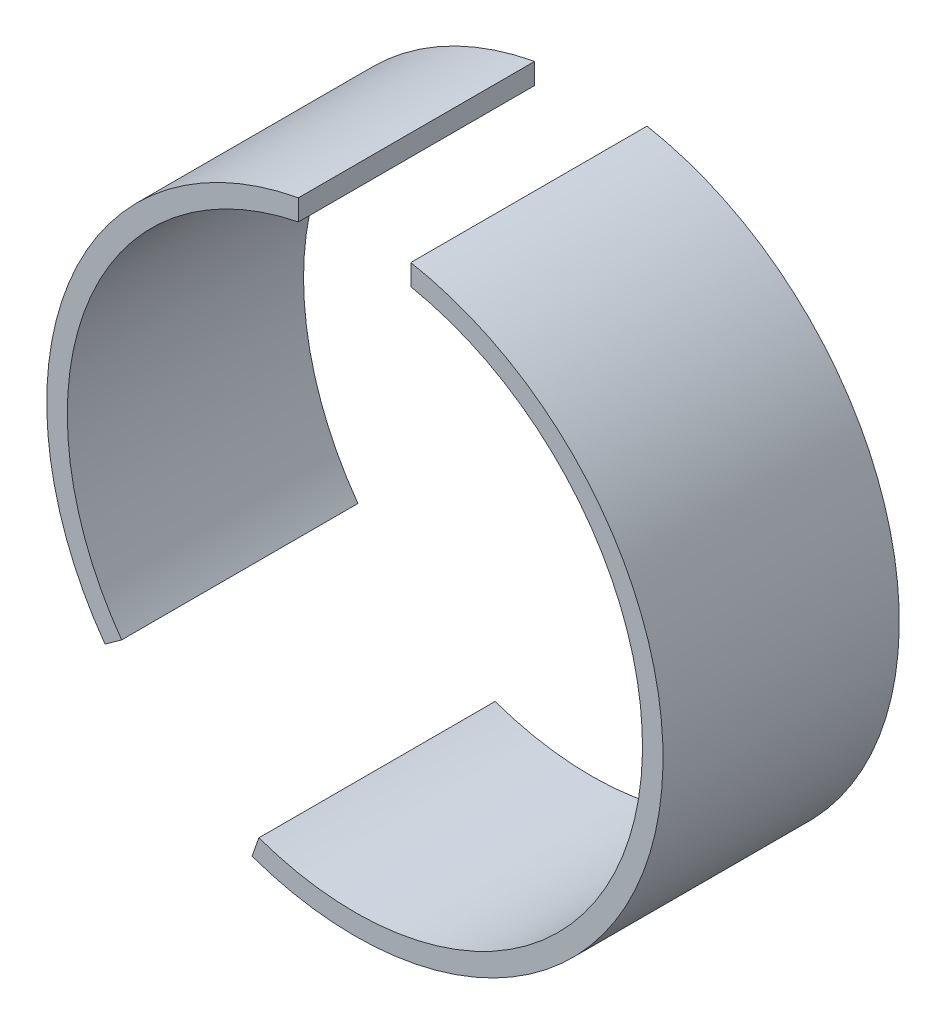
ISO-10303-21;
HEADER;
FILE_DESCRIPTION(('STEP AP214'),'2;1');
FILE_NAME('part.step','',(''),(''),'','','');
FILE_SCHEMA(('AUTOMOTIVE_DESIGN { 1 0 10303 214 1 1 1 1 }'));
ENDSEC;
DATA;
#1=APPLICATION_CONTEXT('core data for automotive mechanical design processes');
#2=APPLICATION_PROTOCOL_DEFINITION('international standard','automotive_design',2000,#1);
#3=PRODUCT_CONTEXT('',#1,'mechanical');
#4=PRODUCT('Part','Part','',(#3));
#5=PRODUCT_RELATED_PRODUCT_CATEGORY('part','',(#4));
#6=PRODUCT_DEFINITION_FORMATION('','',#4);
#7=PRODUCT_DEFINITION_CONTEXT('part definition',#1,'design');
#8=PRODUCT_DEFINITION('design','',#6,#7);
#9=PRODUCT_DEFINITION_SHAPE('','',#8);
#10=(LENGTH_UNIT() NAMED_UNIT(*) SI_UNIT(.MILLI.,.METRE.));
#11=(NAMED_UNIT(*) PLANE_ANGLE_UNIT() SI_UNIT($,.RADIAN.));
#12=(NAMED_UNIT(*) SI_UNIT($,.STERADIAN.) SOLID_ANGLE_UNIT());
#13=UNCERTAINTY_MEASURE_WITH_UNIT(LENGTH_MEASURE(1.E-05),#10,'distance_accuracy_value','');
#14=(GEOMETRIC_REPRESENTATION_CONTEXT(3) GLOBAL_UNCERTAINTY_ASSIGNED_CONTEXT((#13)) GLOBAL_UNIT_ASSIGNED_CONTEXT((#10,
#11,#12)) REPRESENTATION_CONTEXT('',''));
#15=CARTESIAN_POINT('',(0.,0.,0.));
#16=DIRECTION('',(0.,0.,1.));
#17=DIRECTION('',(1.,0.,0.));
#18=AXIS2_PLACEMENT_3D('',#15,#16,#17);
#19=CARTESIAN_POINT('',(0.,0.,23.));
#20=DIRECTION('',(0.,0.,-1.));
#21=DIRECTION('',(-1.,0.,0.));
#22=AXIS2_PLACEMENT_3D('',#19,#20,#21);
#23=CYLINDRICAL_SURFACE('',#22,28.);
#24=CARTESIAN_POINT('',(0.,0.,0.));
#25=DIRECTION('',(0.,0.,-1.));
#26=DIRECTION('',(1.,0.,0.));
#27=AXIS2_PLACEMENT_3D('',#24,#25,#26);
#28=CIRCLE('',#27,28.);
#29=CARTESIAN_POINT('',(-22.7044689300606,-16.3861859687944,0.));
#30=VERTEX_POINT('',#29);
#31=CARTESIAN_POINT('',(-5.50000000000001,27.4545078265847,0.));
#32=VERTEX_POINT('',#31);
#33=EDGE_CURVE('E106',#30,#32,#28,.T.);
#34=ORIENTED_EDGE('',*,*,#33,.T.);
#35=DIRECTION('',(0.,0.,-1.));
#36=VECTOR('',#35,1.);
#37=CARTESIAN_POINT('',(-5.50000000000001,27.4545078265847,23.));
#38=LINE('',#37,#36);
#39=CARTESIAN_POINT('',(-5.50000000000001,27.4545078265847,23.));
#40=VERTEX_POINT('',#39);
#41=EDGE_CURVE('E12',#40,#32,#38,.T.);
#42=ORIENTED_EDGE('',*,*,#41,.F.);
#43=CARTESIAN_POINT('',(0.,0.,23.));
#44=DIRECTION('',(0.,0.,-1.));
#45=DIRECTION('',(1.,0.,0.));
#46=AXIS2_PLACEMENT_3D('',#43,#44,#45);
#47=CIRCLE('',#46,28.);
#48=CARTESIAN_POINT('',(-22.7044689300606,-16.3861859687944,23.));
#49=VERTEX_POINT('',#48);
#50=EDGE_CURVE('E94',#49,#40,#47,.T.);
#51=ORIENTED_EDGE('',*,*,#50,.F.);
#52=DIRECTION('',(0.,0.,-1.));
#53=VECTOR('',#52,1.);
#54=CARTESIAN_POINT('',(-22.7044689300606,-16.3861859687944,23.));
#55=LINE('',#54,#53);
#56=EDGE_CURVE('E102',#49,#30,#55,.T.);
#57=ORIENTED_EDGE('',*,*,#56,.T.);
#58=EDGE_LOOP('',(#34,#42,#51,#57));
#59=FACE_BOUND('',#58,.T.);
#60=ADVANCED_FACE('F43',(#59),#23,.F.);
#61=CARTESIAN_POINT('',(-5.50000000000001,29.4915242061173,23.));
#62=DIRECTION('',(-1.,0.,0.));
#63=DIRECTION('',(0.,0.,1.));
#64=AXIS2_PLACEMENT_3D('',#61,#62,#63);
#65=PLANE('',#64);
#66=DIRECTION('',(0.,1.,0.));
#67=VECTOR('',#66,1.);
#68=CARTESIAN_POINT('',(-5.50000000000001,29.4915242061173,0.));
#69=LINE('',#68,#67);
#70=CARTESIAN_POINT('',(-5.5,29.4915242061173,0.));
#71=VERTEX_POINT('',#70);
#72=EDGE_CURVE('E98',#32,#71,#69,.T.);
#73=ORIENTED_EDGE('',*,*,#72,.T.);
#74=DIRECTION('',(0.,0.,-1.));
#75=VECTOR('',#74,1.);
#76=CARTESIAN_POINT('',(-5.5,29.4915242061173,23.));
#77=LINE('',#76,#75);
#78=CARTESIAN_POINT('',(-5.5,29.4915242061173,23.));
#79=VERTEX_POINT('',#78);
#80=EDGE_CURVE('E51',#79,#71,#77,.T.);
#81=ORIENTED_EDGE('',*,*,#80,.F.);
#82=DIRECTION('',(0.,1.,0.));
#83=VECTOR('',#82,1.);
#84=CARTESIAN_POINT('',(-5.50000000000001,29.4915242061173,23.));
#85=LINE('',#84,#83);
#86=EDGE_CURVE('E89',#40,#79,#85,.T.);
#87=ORIENTED_EDGE('',*,*,#86,.F.);
#88=ORIENTED_EDGE('',*,*,#41,.T.);
#89=EDGE_LOOP('',(#73,#81,#87,#88));
#90=FACE_BOUND('',#89,.T.);
#91=ADVANCED_FACE('F97',(#90),#65,.F.);
#92=CARTESIAN_POINT('',(0.,0.,23.));
#93=DIRECTION('',(0.,0.,-1.));
#94=DIRECTION('',(-1.,0.,0.));
#95=AXIS2_PLACEMENT_3D('',#92,#93,#94);
#96=CYLINDRICAL_SURFACE('',#95,30.);
#97=CARTESIAN_POINT('',(0.,0.,0.));
#98=DIRECTION('',(0.,0.,1.));
#99=DIRECTION('',(1.,0.,0.));
#100=AXIS2_PLACEMENT_3D('',#97,#98,#99);
#101=CIRCLE('',#100,30.);
#102=CARTESIAN_POINT('',(-24.3262167107792,-17.5566278237082,0.));
#103=VERTEX_POINT('',#102);
#104=EDGE_CURVE('E76',#71,#103,#101,.T.);
#105=ORIENTED_EDGE('',*,*,#104,.T.);
#106=DIRECTION('',(0.,0.,-1.));
#107=VECTOR('',#106,1.);
#108=CARTESIAN_POINT('',(-24.3262167107792,-17.5566278237082,23.));
#109=LINE('',#108,#107);
#110=CARTESIAN_POINT('',(-24.3262167107792,-17.5566278237082,23.));
#111=VERTEX_POINT('',#110);
#112=EDGE_CURVE('E99',#111,#103,#109,.T.);
#113=ORIENTED_EDGE('',*,*,#112,.F.);
#114=CARTESIAN_POINT('',(0.,0.,23.));
#115=DIRECTION('',(0.,0.,1.));
#116=DIRECTION('',(1.,0.,0.));
#117=AXIS2_PLACEMENT_3D('',#114,#115,#116);
#118=CIRCLE('',#117,30.);
#119=EDGE_CURVE('E92',#79,#111,#118,.T.);
#120=ORIENTED_EDGE('',*,*,#119,.F.);
#121=ORIENTED_EDGE('',*,*,#80,.T.);
#122=EDGE_LOOP('',(#105,#113,#120,#121));
#123=FACE_BOUND('',#122,.T.);
#124=ADVANCED_FACE('F100',(#123),#96,.T.);
#125=CARTESIAN_POINT('',(-24.3262167107792,-17.5566278237082,23.));
#126=DIRECTION('',(-0.58522092745694,0.810873890359308,0.));
#127=DIRECTION('',(-0.810873890359308,-0.58522092745694,0.));
#128=AXIS2_PLACEMENT_3D('',#125,#126,#127);
#129=PLANE('',#128);
#130=DIRECTION('',(0.810873890359308,0.58522092745694,0.));
#131=VECTOR('',#130,1.);
#132=CARTESIAN_POINT('',(-24.3262167107792,-17.5566278237082,0.));
#133=LINE('',#132,#131);
#134=EDGE_CURVE('E82',#103,#30,#133,.T.);
#135=ORIENTED_EDGE('',*,*,#134,.T.);
#136=ORIENTED_EDGE('',*,*,#56,.F.);
#137=DIRECTION('',(0.810873890359308,0.58522092745694,0.));
#138=VECTOR('',#137,1.);
#139=CARTESIAN_POINT('',(-24.3262167107792,-17.5566278237082,23.));
#140=LINE('',#139,#138);
#141=EDGE_CURVE('E59',#111,#49,#140,.T.);
#142=ORIENTED_EDGE('',*,*,#141,.F.);
#143=ORIENTED_EDGE('',*,*,#112,.T.);
#144=EDGE_LOOP('',(#135,#136,#142,#143));
#145=FACE_BOUND('',#144,.T.);
#146=ADVANCED_FACE('F113',(#145),#129,.F.);
#147=CARTESIAN_POINT('',(0.,0.,23.));
#148=DIRECTION('',(0.,0.,1.));
#149=DIRECTION('',(1.,0.,0.));
#150=AXIS2_PLACEMENT_3D('',#147,#148,#149);
#151=PLANE('',#150);
#152=ORIENTED_EDGE('',*,*,#50,.T.);
#153=ORIENTED_EDGE('',*,*,#86,.T.);
#154=ORIENTED_EDGE('',*,*,#119,.T.);
#155=ORIENTED_EDGE('',*,*,#141,.T.);
#156=EDGE_LOOP('',(#152,#153,#154,#155));
#157=FACE_BOUND('',#156,.T.);
#158=ADVANCED_FACE('F90',(#157),#151,.T.);
#159=CARTESIAN_POINT('',(0.,0.,0.));
#160=DIRECTION('',(0.,0.,1.));
#161=DIRECTION('',(1.,0.,0.));
#162=AXIS2_PLACEMENT_3D('',#159,#160,#161);
#163=PLANE('',#162);
#164=ORIENTED_EDGE('',*,*,#33,.F.);
#165=ORIENTED_EDGE('',*,*,#134,.F.);
#166=ORIENTED_EDGE('',*,*,#104,.F.);
#167=ORIENTED_EDGE('',*,*,#72,.F.);
#168=EDGE_LOOP('',(#164,#165,#166,#167));
#169=FACE_BOUND('',#168,.T.);
#170=ADVANCED_FACE('F116',(#169),#163,.F.);
#171=CLOSED_SHELL('',(#60,#91,#124,#146,#158,#170));
#172=MANIFOLD_SOLID_BREP('B2',#171);
#173=CARTESIAN_POINT('',(0.,0.,23.));
#174=DIRECTION('',(0.,0.,-1.));
#175=DIRECTION('',(-1.,0.,0.));
#176=AXIS2_PLACEMENT_3D('',#173,#174,#175);
#177=CYLINDRICAL_SURFACE('',#176,28.);
#178=CARTESIAN_POINT('',(0.,0.,0.));
#179=DIRECTION('',(0.,0.,-1.));
#180=DIRECTION('',(1.,0.,0.));
#181=AXIS2_PLACEMENT_3D('',#178,#179,#180);
#182=CIRCLE('',#181,28.);
#183=CARTESIAN_POINT('',(5.4399636048201,27.4664667545397,0.));
#184=VERTEX_POINT('',#183);
#185=CARTESIAN_POINT('',(-9.34637864421615,-26.3940373235877,0.));
#186=VERTEX_POINT('',#185);
#187=EDGE_CURVE('E230',#184,#186,#182,.T.);
#188=ORIENTED_EDGE('',*,*,#187,.T.);
#189=DIRECTION('',(0.,0.,-1.));
#190=VECTOR('',#189,1.);
#191=CARTESIAN_POINT('',(-9.34637864421615,-26.3940373235877,23.));
#192=LINE('',#191,#190);
#193=CARTESIAN_POINT('',(-9.34637864421615,-26.3940373235877,23.));
#194=VERTEX_POINT('',#193);
#195=EDGE_CURVE('E41',#194,#186,#192,.T.);
#196=ORIENTED_EDGE('',*,*,#195,.F.);
#197=CARTESIAN_POINT('',(0.,0.,23.));
#198=DIRECTION('',(0.,0.,-1.));
#199=DIRECTION('',(1.,0.,0.));
#200=AXIS2_PLACEMENT_3D('',#197,#198,#199);
#201=CIRCLE('',#200,28.);
#202=CARTESIAN_POINT('',(5.4399636048201,27.4664667545397,23.));
#203=VERTEX_POINT('',#202);
#204=EDGE_CURVE('E218',#203,#194,#201,.T.);
#205=ORIENTED_EDGE('',*,*,#204,.F.);
#206=DIRECTION('',(0.,0.,-1.));
#207=VECTOR('',#206,1.);
#208=CARTESIAN_POINT('',(5.4399636048201,27.4664667545397,23.));
#209=LINE('',#208,#207);
#210=EDGE_CURVE('E226',#203,#184,#209,.T.);
#211=ORIENTED_EDGE('',*,*,#210,.T.);
#212=EDGE_LOOP('',(#188,#196,#205,#211));
#213=FACE_BOUND('',#212,.T.);
#214=ADVANCED_FACE('F167',(#213),#177,.F.);
#215=CARTESIAN_POINT('',(-9.34637864421615,-26.3940373235877,23.));
#216=DIRECTION('',(0.942644190128132,-0.333799237293433,0.));
#217=DIRECTION('',(0.333799237293434,0.942644190128132,0.));
#218=AXIS2_PLACEMENT_3D('',#215,#216,#217);
#219=PLANE('',#218);
#220=DIRECTION('',(-0.333799237293434,-0.942644190128132,0.));
#221=VECTOR('',#220,1.);
#222=CARTESIAN_POINT('',(-9.34637864421615,-26.3940373235877,0.));
#223=LINE('',#222,#221);
#224=CARTESIAN_POINT('',(-10.013977118803,-28.279325703844,0.));
#225=VERTEX_POINT('',#224);
#226=EDGE_CURVE('E222',#186,#225,#223,.T.);
#227=ORIENTED_EDGE('',*,*,#226,.T.);
#228=DIRECTION('',(0.,0.,-1.));
#229=VECTOR('',#228,1.);
#230=CARTESIAN_POINT('',(-10.013977118803,-28.279325703844,23.));
#231=LINE('',#230,#229);
#232=CARTESIAN_POINT('',(-10.013977118803,-28.279325703844,23.));
#233=VERTEX_POINT('',#232);
#234=EDGE_CURVE('E175',#233,#225,#231,.T.);
#235=ORIENTED_EDGE('',*,*,#234,.F.);
#236=DIRECTION('',(-0.333799237293434,-0.942644190128132,0.));
#237=VECTOR('',#236,1.);
#238=CARTESIAN_POINT('',(-9.34637864421615,-26.3940373235877,23.));
#239=LINE('',#238,#237);
#240=EDGE_CURVE('E213',#194,#233,#239,.T.);
#241=ORIENTED_EDGE('',*,*,#240,.F.);
#242=ORIENTED_EDGE('',*,*,#195,.T.);
#243=EDGE_LOOP('',(#227,#235,#241,#242));
#244=FACE_BOUND('',#243,.T.);
#245=ADVANCED_FACE('F221',(#244),#219,.F.);
#246=CARTESIAN_POINT('',(0.,0.,23.));
#247=DIRECTION('',(0.,0.,-1.));
#248=DIRECTION('',(-1.,0.,0.));
#249=AXIS2_PLACEMENT_3D('',#246,#247,#248);
#250=CYLINDRICAL_SURFACE('',#249,30.);
#251=CARTESIAN_POINT('',(0.,0.,0.));
#252=DIRECTION('',(0.,0.,1.));
#253=DIRECTION('',(1.,0.,0.));
#254=AXIS2_PLACEMENT_3D('',#251,#252,#253);
#255=CIRCLE('',#254,30.);
#256=CARTESIAN_POINT('',(5.4399636048201,29.5026574392585,0.));
#257=VERTEX_POINT('',#256);
#258=EDGE_CURVE('E200',#225,#257,#255,.T.);
#259=ORIENTED_EDGE('',*,*,#258,.T.);
#260=DIRECTION('',(0.,0.,-1.));
#261=VECTOR('',#260,1.);
#262=CARTESIAN_POINT('',(5.4399636048201,29.5026574392585,23.));
#263=LINE('',#262,#261);
#264=CARTESIAN_POINT('',(5.4399636048201,29.5026574392585,23.));
#265=VERTEX_POINT('',#264);
#266=EDGE_CURVE('E223',#265,#257,#263,.T.);
#267=ORIENTED_EDGE('',*,*,#266,.F.);
#268=CARTESIAN_POINT('',(0.,0.,23.));
#269=DIRECTION('',(0.,0.,1.));
#270=DIRECTION('',(1.,0.,0.));
#271=AXIS2_PLACEMENT_3D('',#268,#269,#270);
#272=CIRCLE('',#271,30.);
#273=EDGE_CURVE('E216',#233,#265,#272,.T.);
#274=ORIENTED_EDGE('',*,*,#273,.F.);
#275=ORIENTED_EDGE('',*,*,#234,.T.);
#276=EDGE_LOOP('',(#259,#267,#274,#275));
#277=FACE_BOUND('',#276,.T.);
#278=ADVANCED_FACE('F224',(#277),#250,.T.);
#279=CARTESIAN_POINT('',(5.4399636048201,27.4664667545397,23.));
#280=DIRECTION('',(1.,0.,0.));
#281=DIRECTION('',(0.,0.,-1.));
#282=AXIS2_PLACEMENT_3D('',#279,#280,#281);
#283=PLANE('',#282);
#284=DIRECTION('',(0.,-1.,0.));
#285=VECTOR('',#284,1.);
#286=CARTESIAN_POINT('',(5.4399636048201,27.4664667545397,0.));
#287=LINE('',#286,#285);
#288=EDGE_CURVE('E206',#257,#184,#287,.T.);
#289=ORIENTED_EDGE('',*,*,#288,.T.);
#290=ORIENTED_EDGE('',*,*,#210,.F.);
#291=DIRECTION('',(0.,-1.,0.));
#292=VECTOR('',#291,1.);
#293=CARTESIAN_POINT('',(5.4399636048201,27.4664667545397,23.));
#294=LINE('',#293,#292);
#295=EDGE_CURVE('E183',#265,#203,#294,.T.);
#296=ORIENTED_EDGE('',*,*,#295,.F.);
#297=ORIENTED_EDGE('',*,*,#266,.T.);
#298=EDGE_LOOP('',(#289,#290,#296,#297));
#299=FACE_BOUND('',#298,.T.);
#300=ADVANCED_FACE('F237',(#299),#283,.F.);
#301=CARTESIAN_POINT('',(0.,0.,23.));
#302=DIRECTION('',(0.,0.,1.));
#303=DIRECTION('',(1.,0.,0.));
#304=AXIS2_PLACEMENT_3D('',#301,#302,#303);
#305=PLANE('',#304);
#306=ORIENTED_EDGE('',*,*,#204,.T.);
#307=ORIENTED_EDGE('',*,*,#240,.T.);
#308=ORIENTED_EDGE('',*,*,#273,.T.);
#309=ORIENTED_EDGE('',*,*,#295,.T.);
#310=EDGE_LOOP('',(#306,#307,#308,#309));
#311=FACE_BOUND('',#310,.T.);
#312=ADVANCED_FACE('F214',(#311),#305,.T.);
#313=CARTESIAN_POINT('',(0.,0.,0.));
#314=DIRECTION('',(0.,0.,1.));
#315=DIRECTION('',(1.,0.,0.));
#316=AXIS2_PLACEMENT_3D('',#313,#314,#315);
#317=PLANE('',#316);
#318=ORIENTED_EDGE('',*,*,#187,.F.);
#319=ORIENTED_EDGE('',*,*,#288,.F.);
#320=ORIENTED_EDGE('',*,*,#258,.F.);
#321=ORIENTED_EDGE('',*,*,#226,.F.);
#322=EDGE_LOOP('',(#318,#319,#320,#321));
#323=FACE_BOUND('',#322,.T.);
#324=ADVANCED_FACE('F240',(#323),#317,.F.);
#325=CLOSED_SHELL('',(#214,#245,#278,#300,#312,#324));
#326=MANIFOLD_SOLID_BREP('B6',#325);
#327=ADVANCED_BREP_SHAPE_REPRESENTATION('',(#18,#172,#326),#14);
#328=SHAPE_DEFINITION_REPRESENTATION(#9,#327);
ENDSEC;
END-ISO-10303-21;
